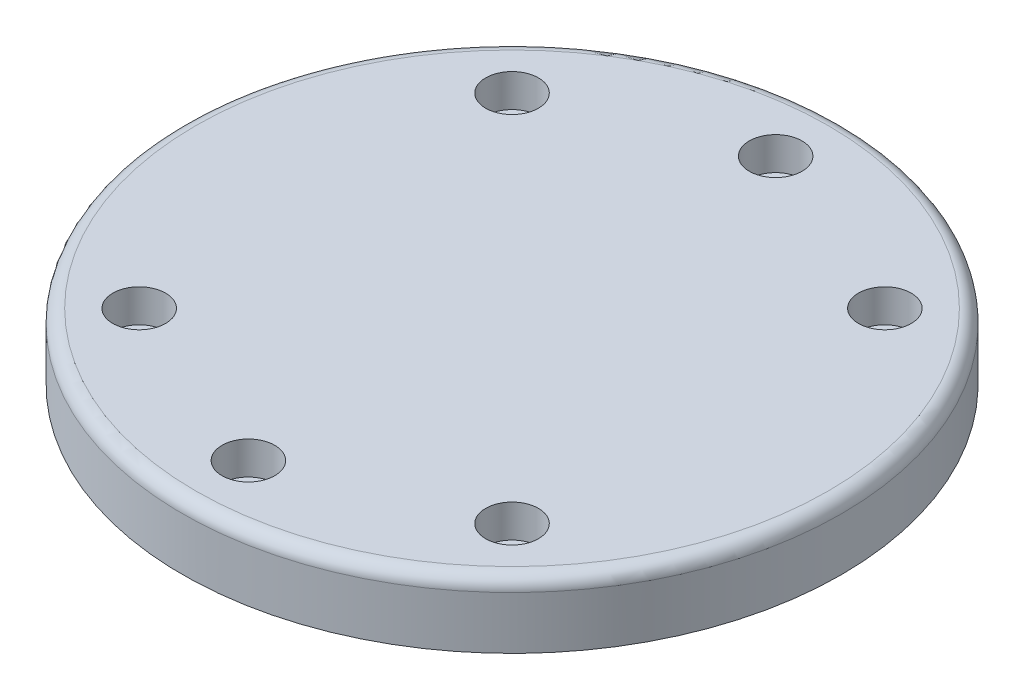
ISO-10303-21;
HEADER;
FILE_DESCRIPTION(('STEP AP214'),'2;1');
FILE_NAME('part.step','',(''),(''),'','','');
FILE_SCHEMA(('AUTOMOTIVE_DESIGN { 1 0 10303 214 1 1 1 1 }'));
ENDSEC;
DATA;
#1=APPLICATION_CONTEXT('core data for automotive mechanical design processes');
#2=APPLICATION_PROTOCOL_DEFINITION('international standard','automotive_design',2000,#1);
#3=PRODUCT_CONTEXT('',#1,'mechanical');
#4=PRODUCT('Part','Part','',(#3));
#5=PRODUCT_RELATED_PRODUCT_CATEGORY('part','',(#4));
#6=PRODUCT_DEFINITION_FORMATION('','',#4);
#7=PRODUCT_DEFINITION_CONTEXT('part definition',#1,'design');
#8=PRODUCT_DEFINITION('design','',#6,#7);
#9=PRODUCT_DEFINITION_SHAPE('','',#8);
#10=(LENGTH_UNIT() NAMED_UNIT(*) SI_UNIT(.MILLI.,.METRE.));
#11=(NAMED_UNIT(*) PLANE_ANGLE_UNIT() SI_UNIT($,.RADIAN.));
#12=(NAMED_UNIT(*) SI_UNIT($,.STERADIAN.) SOLID_ANGLE_UNIT());
#13=UNCERTAINTY_MEASURE_WITH_UNIT(LENGTH_MEASURE(1.E-05),#10,'distance_accuracy_value','');
#14=(GEOMETRIC_REPRESENTATION_CONTEXT(3) GLOBAL_UNCERTAINTY_ASSIGNED_CONTEXT((#13)) GLOBAL_UNIT_ASSIGNED_CONTEXT((#10,
#11,#12)) REPRESENTATION_CONTEXT('',''));
#15=CARTESIAN_POINT('',(0.,0.,0.));
#16=DIRECTION('',(0.,0.,1.));
#17=DIRECTION('',(1.,0.,0.));
#18=AXIS2_PLACEMENT_3D('',#15,#16,#17);
#19=CARTESIAN_POINT('',(0.,0.,0.));
#20=DIRECTION('',(0.,1.,0.));
#21=DIRECTION('',(1.,0.,0.));
#22=AXIS2_PLACEMENT_3D('',#19,#20,#21);
#23=PLANE('',#22);
#24=CARTESIAN_POINT('',(0.,0.,-40.));
#25=DIRECTION('',(0.,1.,0.));
#26=DIRECTION('',(1.,0.,0.));
#27=AXIS2_PLACEMENT_3D('',#24,#25,#26);
#28=CIRCLE('',#27,2.25);
#29=CARTESIAN_POINT('',(-2.25,0.,-40.));
#30=VERTEX_POINT('',#29);
#31=EDGE_CURVE('E184',#30,#30,#28,.T.);
#32=ORIENTED_EDGE('',*,*,#31,.T.);
#33=EDGE_LOOP('',(#32));
#34=FACE_BOUND('',#33,.T.);
#35=CARTESIAN_POINT('',(0.,0.,40.));
#36=DIRECTION('',(0.,1.,0.));
#37=DIRECTION('',(1.,0.,0.));
#38=AXIS2_PLACEMENT_3D('',#35,#36,#37);
#39=CIRCLE('',#38,2.25);
#40=CARTESIAN_POINT('',(-2.25,0.,40.));
#41=VERTEX_POINT('',#40);
#42=EDGE_CURVE('E244',#41,#41,#39,.T.);
#43=ORIENTED_EDGE('',*,*,#42,.T.);
#44=EDGE_LOOP('',(#43));
#45=FACE_BOUND('',#44,.T.);
#46=CARTESIAN_POINT('',(-28.2842712474619,0.,-28.2842712474619));
#47=DIRECTION('',(0.,1.,0.));
#48=DIRECTION('',(1.,0.,0.));
#49=AXIS2_PLACEMENT_3D('',#46,#47,#48);
#50=CIRCLE('',#49,2.);
#51=CARTESIAN_POINT('',(-30.2842712474619,0.,-28.2842712474619));
#52=VERTEX_POINT('',#51);
#53=EDGE_CURVE('E164',#52,#52,#50,.T.);
#54=ORIENTED_EDGE('',*,*,#53,.T.);
#55=EDGE_LOOP('',(#54));
#56=FACE_BOUND('',#55,.T.);
#57=CARTESIAN_POINT('',(28.2842712474619,0.,28.2842712474619));
#58=DIRECTION('',(0.,1.,0.));
#59=DIRECTION('',(1.,0.,0.));
#60=AXIS2_PLACEMENT_3D('',#57,#58,#59);
#61=CIRCLE('',#60,2.);
#62=CARTESIAN_POINT('',(26.2842712474619,0.,28.2842712474619));
#63=VERTEX_POINT('',#62);
#64=EDGE_CURVE('E203',#63,#63,#61,.T.);
#65=ORIENTED_EDGE('',*,*,#64,.T.);
#66=EDGE_LOOP('',(#65));
#67=FACE_BOUND('',#66,.T.);
#68=CARTESIAN_POINT('',(-28.2842712474619,0.,28.2842712474619));
#69=DIRECTION('',(0.,1.,0.));
#70=DIRECTION('',(1.,0.,0.));
#71=AXIS2_PLACEMENT_3D('',#68,#69,#70);
#72=CIRCLE('',#71,2.);
#73=CARTESIAN_POINT('',(-30.2842712474619,0.,28.2842712474619));
#74=VERTEX_POINT('',#73);
#75=EDGE_CURVE('E145',#74,#74,#72,.T.);
#76=ORIENTED_EDGE('',*,*,#75,.T.);
#77=EDGE_LOOP('',(#76));
#78=FACE_BOUND('',#77,.T.);
#79=CARTESIAN_POINT('',(28.2842712474619,0.,-28.2842712474619));
#80=DIRECTION('',(0.,1.,0.));
#81=DIRECTION('',(1.,0.,0.));
#82=AXIS2_PLACEMENT_3D('',#79,#80,#81);
#83=CIRCLE('',#82,2.);
#84=CARTESIAN_POINT('',(26.2842712474619,0.,-28.2842712474619));
#85=VERTEX_POINT('',#84);
#86=EDGE_CURVE('E220',#85,#85,#83,.T.);
#87=ORIENTED_EDGE('',*,*,#86,.T.);
#88=EDGE_LOOP('',(#87));
#89=FACE_BOUND('',#88,.T.);
#90=CARTESIAN_POINT('',(0.,0.,0.));
#91=DIRECTION('',(0.,1.,0.));
#92=DIRECTION('',(-1.,0.,0.));
#93=AXIS2_PLACEMENT_3D('',#90,#91,#92);
#94=CIRCLE('',#93,50.);
#95=CARTESIAN_POINT('',(50.,0.,0.));
#96=VERTEX_POINT('',#95);
#97=EDGE_CURVE('E11',#96,#96,#94,.T.);
#98=ORIENTED_EDGE('',*,*,#97,.F.);
#99=EDGE_LOOP('',(#98));
#100=FACE_BOUND('',#99,.T.);
#101=ADVANCED_FACE('F17',(#34,#45,#56,#67,#78,#89,#100),#23,.F.);
#102=CARTESIAN_POINT('',(0.,10.,0.));
#103=DIRECTION('',(0.,1.,0.));
#104=DIRECTION('',(1.,0.,0.));
#105=AXIS2_PLACEMENT_3D('',#102,#103,#104);
#106=PLANE('',#105);
#107=CARTESIAN_POINT('',(0.,10.,-40.));
#108=DIRECTION('',(0.,-1.,0.));
#109=DIRECTION('',(1.,0.,0.));
#110=AXIS2_PLACEMENT_3D('',#107,#108,#109);
#111=CIRCLE('',#110,4.);
#112=CARTESIAN_POINT('',(-4.,10.,-40.));
#113=VERTEX_POINT('',#112);
#114=EDGE_CURVE('E208',#113,#113,#111,.T.);
#115=ORIENTED_EDGE('',*,*,#114,.T.);
#116=EDGE_LOOP('',(#115));
#117=FACE_BOUND('',#116,.T.);
#118=CARTESIAN_POINT('',(0.,10.,40.));
#119=DIRECTION('',(0.,-1.,0.));
#120=DIRECTION('',(1.,0.,0.));
#121=AXIS2_PLACEMENT_3D('',#118,#119,#120);
#122=CIRCLE('',#121,4.);
#123=CARTESIAN_POINT('',(-4.,10.,40.));
#124=VERTEX_POINT('',#123);
#125=EDGE_CURVE('E21',#124,#124,#122,.T.);
#126=ORIENTED_EDGE('',*,*,#125,.T.);
#127=EDGE_LOOP('',(#126));
#128=FACE_BOUND('',#127,.T.);
#129=CARTESIAN_POINT('',(-28.2842712474619,10.,-28.2842712474619));
#130=DIRECTION('',(0.,-1.,0.));
#131=DIRECTION('',(1.,0.,0.));
#132=AXIS2_PLACEMENT_3D('',#129,#130,#131);
#133=CIRCLE('',#132,4.);
#134=CARTESIAN_POINT('',(-32.2842712474619,10.,-28.2842712474619));
#135=VERTEX_POINT('',#134);
#136=EDGE_CURVE('E193',#135,#135,#133,.T.);
#137=ORIENTED_EDGE('',*,*,#136,.T.);
#138=EDGE_LOOP('',(#137));
#139=FACE_BOUND('',#138,.T.);
#140=CARTESIAN_POINT('',(28.2842712474619,10.,28.2842712474619));
#141=DIRECTION('',(0.,-1.,0.));
#142=DIRECTION('',(1.,0.,0.));
#143=AXIS2_PLACEMENT_3D('',#140,#141,#142);
#144=CIRCLE('',#143,4.);
#145=CARTESIAN_POINT('',(24.2842712474619,10.,28.2842712474619));
#146=VERTEX_POINT('',#145);
#147=EDGE_CURVE('E227',#146,#146,#144,.T.);
#148=ORIENTED_EDGE('',*,*,#147,.T.);
#149=EDGE_LOOP('',(#148));
#150=FACE_BOUND('',#149,.T.);
#151=CARTESIAN_POINT('',(-28.2842712474619,10.,28.2842712474619));
#152=DIRECTION('',(0.,-1.,0.));
#153=DIRECTION('',(1.,0.,0.));
#154=AXIS2_PLACEMENT_3D('',#151,#152,#153);
#155=CIRCLE('',#154,4.);
#156=CARTESIAN_POINT('',(-32.2842712474619,10.,28.2842712474619));
#157=VERTEX_POINT('',#156);
#158=EDGE_CURVE('E178',#157,#157,#155,.T.);
#159=ORIENTED_EDGE('',*,*,#158,.T.);
#160=EDGE_LOOP('',(#159));
#161=FACE_BOUND('',#160,.T.);
#162=CARTESIAN_POINT('',(28.2842712474619,10.,-28.2842712474619));
#163=DIRECTION('',(0.,-1.,0.));
#164=DIRECTION('',(1.,0.,0.));
#165=AXIS2_PLACEMENT_3D('',#162,#163,#164);
#166=CIRCLE('',#165,4.);
#167=CARTESIAN_POINT('',(24.2842712474619,10.,-28.2842712474619));
#168=VERTEX_POINT('',#167);
#169=EDGE_CURVE('E167',#168,#168,#166,.T.);
#170=ORIENTED_EDGE('',*,*,#169,.T.);
#171=EDGE_LOOP('',(#170));
#172=FACE_BOUND('',#171,.T.);
#173=CARTESIAN_POINT('',(0.,10.,0.));
#174=DIRECTION('',(0.,-1.,0.));
#175=DIRECTION('',(1.,0.,0.));
#176=AXIS2_PLACEMENT_3D('',#173,#174,#175);
#177=CIRCLE('',#176,48.);
#178=CARTESIAN_POINT('',(0.,10.,-48.));
#179=VERTEX_POINT('',#178);
#180=EDGE_CURVE('E179',#179,#179,#177,.T.);
#181=ORIENTED_EDGE('',*,*,#180,.F.);
#182=EDGE_LOOP('',(#181));
#183=FACE_BOUND('',#182,.T.);
#184=ADVANCED_FACE('F453',(#117,#128,#139,#150,#161,#172,#183),#106,.T.);
#185=CARTESIAN_POINT('',(0.,0.,0.));
#186=DIRECTION('',(0.,1.,0.));
#187=DIRECTION('',(-1.,0.,0.));
#188=AXIS2_PLACEMENT_3D('',#185,#186,#187);
#189=CYLINDRICAL_SURFACE('',#188,50.);
#190=CARTESIAN_POINT('',(0.,8.,0.));
#191=DIRECTION('',(0.,1.,0.));
#192=DIRECTION('',(1.,0.,0.));
#193=AXIS2_PLACEMENT_3D('',#190,#191,#192);
#194=CIRCLE('',#193,50.);
#195=CARTESIAN_POINT('',(0.,8.,-50.));
#196=VERTEX_POINT('',#195);
#197=CARTESIAN_POINT('',(50.,8.,0.));
#198=VERTEX_POINT('',#197);
#199=EDGE_CURVE('E281',#196,#198,#194,.T.);
#200=ORIENTED_EDGE('',*,*,#199,.F.);
#201=CARTESIAN_POINT('',(0.,8.,0.));
#202=DIRECTION('',(0.,1.,0.));
#203=DIRECTION('',(1.,0.,0.));
#204=AXIS2_PLACEMENT_3D('',#201,#202,#203);
#205=CIRCLE('',#204,50.);
#206=EDGE_CURVE('E252',#198,#196,#205,.T.);
#207=ORIENTED_EDGE('',*,*,#206,.F.);
#208=DIRECTION('',(0.,-1.,0.));
#209=VECTOR('',#208,1.);
#210=CARTESIAN_POINT('',(50.,0.,0.));
#211=LINE('',#210,#209);
#212=EDGE_CURVE('E28',#198,#96,#211,.T.);
#213=ORIENTED_EDGE('',*,*,#212,.T.);
#214=ORIENTED_EDGE('',*,*,#97,.T.);
#215=ORIENTED_EDGE('',*,*,#212,.F.);
#216=EDGE_LOOP('',(#200,#207,#213,#214,#215));
#217=FACE_BOUND('',#216,.T.);
#218=ADVANCED_FACE('F19',(#217),#189,.T.);
#219=CARTESIAN_POINT('',(0.,8.,0.));
#220=DIRECTION('',(0.,1.,0.));
#221=DIRECTION('',(0.,0.,1.));
#222=AXIS2_PLACEMENT_3D('',#219,#220,#221);
#223=TOROIDAL_SURFACE('',#222,48.,2.);
#224=ORIENTED_EDGE('',*,*,#180,.T.);
#225=CARTESIAN_POINT('',(0.,8.,-48.));
#226=DIRECTION('',(-1.,0.,0.));
#227=DIRECTION('',(0.,0.,-1.));
#228=AXIS2_PLACEMENT_3D('',#225,#226,#227);
#229=CIRCLE('',#228,2.);
#230=EDGE_CURVE('E183',#179,#196,#229,.T.);
#231=ORIENTED_EDGE('',*,*,#230,.T.);
#232=ORIENTED_EDGE('',*,*,#199,.T.);
#233=ORIENTED_EDGE('',*,*,#206,.T.);
#234=ORIENTED_EDGE('',*,*,#230,.F.);
#235=EDGE_LOOP('',(#224,#231,#232,#233,#234));
#236=FACE_BOUND('',#235,.T.);
#237=ADVANCED_FACE('F450',(#236),#223,.T.);
#238=CARTESIAN_POINT('',(0.,-134.274468787578,-40.));
#239=DIRECTION('',(0.,1.,0.));
#240=DIRECTION('',(1.,0.,0.));
#241=AXIS2_PLACEMENT_3D('',#238,#239,#240);
#242=CYLINDRICAL_SURFACE('',#241,2.25);
#243=CARTESIAN_POINT('',(0.,5.,-40.));
#244=DIRECTION('',(0.,1.,0.));
#245=DIRECTION('',(1.,0.,0.));
#246=AXIS2_PLACEMENT_3D('',#243,#244,#245);
#247=CIRCLE('',#246,2.25);
#248=CARTESIAN_POINT('',(-2.25,5.,-40.));
#249=VERTEX_POINT('',#248);
#250=EDGE_CURVE('E204',#249,#249,#247,.T.);
#251=ORIENTED_EDGE('',*,*,#250,.T.);
#252=DIRECTION('',(0.,-1.,0.));
#253=VECTOR('',#252,1.);
#254=CARTESIAN_POINT('',(-2.25,-134.274468787578,-40.));
#255=LINE('',#254,#253);
#256=EDGE_CURVE('E195',#249,#30,#255,.T.);
#257=ORIENTED_EDGE('',*,*,#256,.T.);
#258=ORIENTED_EDGE('',*,*,#31,.F.);
#259=ORIENTED_EDGE('',*,*,#256,.F.);
#260=EDGE_LOOP('',(#251,#257,#258,#259));
#261=FACE_BOUND('',#260,.T.);
#262=ADVANCED_FACE('F459',(#261),#242,.F.);
#263=CARTESIAN_POINT('',(0.,7.5,-40.));
#264=DIRECTION('',(0.,1.,0.));
#265=DIRECTION('',(1.,0.,0.));
#266=AXIS2_PLACEMENT_3D('',#263,#264,#265);
#267=CYLINDRICAL_SURFACE('',#266,4.);
#268=ORIENTED_EDGE('',*,*,#114,.F.);
#269=DIRECTION('',(0.,-1.,0.));
#270=VECTOR('',#269,1.);
#271=CARTESIAN_POINT('',(-4.,7.5,-40.));
#272=LINE('',#271,#270);
#273=CARTESIAN_POINT('',(-4.,5.,-40.));
#274=VERTEX_POINT('',#273);
#275=EDGE_CURVE('E199',#113,#274,#272,.T.);
#276=ORIENTED_EDGE('',*,*,#275,.T.);
#277=CARTESIAN_POINT('',(0.,5.,-40.));
#278=DIRECTION('',(0.,1.,0.));
#279=DIRECTION('',(1.,0.,0.));
#280=AXIS2_PLACEMENT_3D('',#277,#278,#279);
#281=CIRCLE('',#280,4.);
#282=EDGE_CURVE('E209',#274,#274,#281,.T.);
#283=ORIENTED_EDGE('',*,*,#282,.F.);
#284=ORIENTED_EDGE('',*,*,#275,.F.);
#285=EDGE_LOOP('',(#268,#276,#283,#284));
#286=FACE_BOUND('',#285,.T.);
#287=ADVANCED_FACE('F472',(#286),#267,.F.);
#288=CARTESIAN_POINT('',(0.,5.,-40.));
#289=DIRECTION('',(0.,1.,0.));
#290=DIRECTION('',(1.,0.,0.));
#291=AXIS2_PLACEMENT_3D('',#288,#289,#290);
#292=PLANE('',#291);
#293=ORIENTED_EDGE('',*,*,#250,.F.);
#294=EDGE_LOOP('',(#293));
#295=FACE_BOUND('',#294,.T.);
#296=ORIENTED_EDGE('',*,*,#282,.T.);
#297=EDGE_LOOP('',(#296));
#298=FACE_BOUND('',#297,.T.);
#299=ADVANCED_FACE('F469',(#295,#298),#292,.T.);
#300=CARTESIAN_POINT('',(0.,-134.274468787578,40.));
#301=DIRECTION('',(0.,1.,0.));
#302=DIRECTION('',(1.,0.,0.));
#303=AXIS2_PLACEMENT_3D('',#300,#301,#302);
#304=CYLINDRICAL_SURFACE('',#303,2.25);
#305=CARTESIAN_POINT('',(0.,5.,40.));
#306=DIRECTION('',(0.,1.,0.));
#307=DIRECTION('',(1.,0.,0.));
#308=AXIS2_PLACEMENT_3D('',#305,#306,#307);
#309=CIRCLE('',#308,2.25);
#310=CARTESIAN_POINT('',(-2.25,5.,40.));
#311=VERTEX_POINT('',#310);
#312=EDGE_CURVE('E271',#311,#311,#309,.T.);
#313=ORIENTED_EDGE('',*,*,#312,.T.);
#314=DIRECTION('',(0.,-1.,0.));
#315=VECTOR('',#314,1.);
#316=CARTESIAN_POINT('',(-2.25,-134.274468787578,40.));
#317=LINE('',#316,#315);
#318=EDGE_CURVE('E232',#311,#41,#317,.T.);
#319=ORIENTED_EDGE('',*,*,#318,.T.);
#320=ORIENTED_EDGE('',*,*,#42,.F.);
#321=ORIENTED_EDGE('',*,*,#318,.F.);
#322=EDGE_LOOP('',(#313,#319,#320,#321));
#323=FACE_BOUND('',#322,.T.);
#324=ADVANCED_FACE('F316',(#323),#304,.F.);
#325=CARTESIAN_POINT('',(0.,7.5,40.));
#326=DIRECTION('',(0.,1.,0.));
#327=DIRECTION('',(1.,0.,0.));
#328=AXIS2_PLACEMENT_3D('',#325,#326,#327);
#329=CYLINDRICAL_SURFACE('',#328,4.);
#330=ORIENTED_EDGE('',*,*,#125,.F.);
#331=DIRECTION('',(0.,-1.,0.));
#332=VECTOR('',#331,1.);
#333=CARTESIAN_POINT('',(-4.,7.5,40.));
#334=LINE('',#333,#332);
#335=CARTESIAN_POINT('',(-4.,5.,40.));
#336=VERTEX_POINT('',#335);
#337=EDGE_CURVE('E229',#124,#336,#334,.T.);
#338=ORIENTED_EDGE('',*,*,#337,.T.);
#339=CARTESIAN_POINT('',(0.,5.,40.));
#340=DIRECTION('',(0.,1.,0.));
#341=DIRECTION('',(1.,0.,0.));
#342=AXIS2_PLACEMENT_3D('',#339,#340,#341);
#343=CIRCLE('',#342,4.);
#344=EDGE_CURVE('E275',#336,#336,#343,.T.);
#345=ORIENTED_EDGE('',*,*,#344,.F.);
#346=ORIENTED_EDGE('',*,*,#337,.F.);
#347=EDGE_LOOP('',(#330,#338,#345,#346));
#348=FACE_BOUND('',#347,.T.);
#349=ADVANCED_FACE('F323',(#348),#329,.F.);
#350=CARTESIAN_POINT('',(0.,5.,40.));
#351=DIRECTION('',(0.,1.,0.));
#352=DIRECTION('',(1.,0.,0.));
#353=AXIS2_PLACEMENT_3D('',#350,#351,#352);
#354=PLANE('',#353);
#355=ORIENTED_EDGE('',*,*,#312,.F.);
#356=EDGE_LOOP('',(#355));
#357=FACE_BOUND('',#356,.T.);
#358=ORIENTED_EDGE('',*,*,#344,.T.);
#359=EDGE_LOOP('',(#358));
#360=FACE_BOUND('',#359,.T.);
#361=ADVANCED_FACE('F319',(#357,#360),#354,.T.);
#362=CARTESIAN_POINT('',(-28.2842712474619,-131.774468787578,-28.2842712474619));
#363=DIRECTION('',(0.,1.,0.));
#364=DIRECTION('',(1.,0.,0.));
#365=AXIS2_PLACEMENT_3D('',#362,#363,#364);
#366=CYLINDRICAL_SURFACE('',#365,2.);
#367=CARTESIAN_POINT('',(-28.2842712474619,5.,-28.2842712474619));
#368=DIRECTION('',(0.,1.,0.));
#369=DIRECTION('',(1.,0.,0.));
#370=AXIS2_PLACEMENT_3D('',#367,#368,#369);
#371=CIRCLE('',#370,2.);
#372=CARTESIAN_POINT('',(-30.2842712474619,5.,-28.2842712474619));
#373=VERTEX_POINT('',#372);
#374=EDGE_CURVE('E189',#373,#373,#371,.T.);
#375=ORIENTED_EDGE('',*,*,#374,.T.);
#376=DIRECTION('',(0.,-1.,0.));
#377=VECTOR('',#376,1.);
#378=CARTESIAN_POINT('',(-30.2842712474619,-131.774468787578,-28.2842712474619));
#379=LINE('',#378,#377);
#380=EDGE_CURVE('E210',#373,#52,#379,.T.);
#381=ORIENTED_EDGE('',*,*,#380,.T.);
#382=ORIENTED_EDGE('',*,*,#53,.F.);
#383=ORIENTED_EDGE('',*,*,#380,.F.);
#384=EDGE_LOOP('',(#375,#381,#382,#383));
#385=FACE_BOUND('',#384,.T.);
#386=ADVANCED_FACE('F322',(#385),#366,.F.);
#387=CARTESIAN_POINT('',(-28.2842712474619,7.5,-28.2842712474619));
#388=DIRECTION('',(0.,1.,0.));
#389=DIRECTION('',(1.,0.,0.));
#390=AXIS2_PLACEMENT_3D('',#387,#388,#389);
#391=CYLINDRICAL_SURFACE('',#390,4.);
#392=ORIENTED_EDGE('',*,*,#136,.F.);
#393=DIRECTION('',(0.,-1.,0.));
#394=VECTOR('',#393,1.);
#395=CARTESIAN_POINT('',(-32.2842712474619,7.5,-28.2842712474619));
#396=LINE('',#395,#394);
#397=CARTESIAN_POINT('',(-32.2842712474619,5.,-28.2842712474619));
#398=VERTEX_POINT('',#397);
#399=EDGE_CURVE('E214',#135,#398,#396,.T.);
#400=ORIENTED_EDGE('',*,*,#399,.T.);
#401=CARTESIAN_POINT('',(-28.2842712474619,5.,-28.2842712474619));
#402=DIRECTION('',(0.,1.,0.));
#403=DIRECTION('',(1.,0.,0.));
#404=AXIS2_PLACEMENT_3D('',#401,#402,#403);
#405=CIRCLE('',#404,4.);
#406=EDGE_CURVE('E194',#398,#398,#405,.T.);
#407=ORIENTED_EDGE('',*,*,#406,.F.);
#408=ORIENTED_EDGE('',*,*,#399,.F.);
#409=EDGE_LOOP('',(#392,#400,#407,#408));
#410=FACE_BOUND('',#409,.T.);
#411=ADVANCED_FACE('F494',(#410),#391,.F.);
#412=CARTESIAN_POINT('',(-28.2842712474619,5.,-28.2842712474619));
#413=DIRECTION('',(0.,1.,0.));
#414=DIRECTION('',(1.,0.,0.));
#415=AXIS2_PLACEMENT_3D('',#412,#413,#414);
#416=PLANE('',#415);
#417=ORIENTED_EDGE('',*,*,#374,.F.);
#418=EDGE_LOOP('',(#417));
#419=FACE_BOUND('',#418,.T.);
#420=ORIENTED_EDGE('',*,*,#406,.T.);
#421=EDGE_LOOP('',(#420));
#422=FACE_BOUND('',#421,.T.);
#423=ADVANCED_FACE('F490',(#419,#422),#416,.T.);
#424=CARTESIAN_POINT('',(28.2842712474619,-131.774468787578,28.2842712474619));
#425=DIRECTION('',(0.,1.,0.));
#426=DIRECTION('',(1.,0.,0.));
#427=AXIS2_PLACEMENT_3D('',#424,#425,#426);
#428=CYLINDRICAL_SURFACE('',#427,2.);
#429=CARTESIAN_POINT('',(28.2842712474619,5.,28.2842712474619));
#430=DIRECTION('',(0.,1.,0.));
#431=DIRECTION('',(1.,0.,0.));
#432=AXIS2_PLACEMENT_3D('',#429,#430,#431);
#433=CIRCLE('',#432,2.);
#434=CARTESIAN_POINT('',(26.2842712474619,5.,28.2842712474619));
#435=VERTEX_POINT('',#434);
#436=EDGE_CURVE('E159',#435,#435,#433,.T.);
#437=ORIENTED_EDGE('',*,*,#436,.T.);
#438=DIRECTION('',(0.,-1.,0.));
#439=VECTOR('',#438,1.);
#440=CARTESIAN_POINT('',(26.2842712474619,-131.774468787578,28.2842712474619));
#441=LINE('',#440,#439);
#442=EDGE_CURVE('E226',#435,#63,#441,.T.);
#443=ORIENTED_EDGE('',*,*,#442,.T.);
#444=ORIENTED_EDGE('',*,*,#64,.F.);
#445=ORIENTED_EDGE('',*,*,#442,.F.);
#446=EDGE_LOOP('',(#437,#443,#444,#445));
#447=FACE_BOUND('',#446,.T.);
#448=ADVANCED_FACE('F493',(#447),#428,.F.);
#449=CARTESIAN_POINT('',(28.2842712474619,7.5,28.2842712474619));
#450=DIRECTION('',(0.,1.,0.));
#451=DIRECTION('',(1.,0.,0.));
#452=AXIS2_PLACEMENT_3D('',#449,#450,#451);
#453=CYLINDRICAL_SURFACE('',#452,4.);
#454=ORIENTED_EDGE('',*,*,#147,.F.);
#455=DIRECTION('',(0.,-1.,0.));
#456=VECTOR('',#455,1.);
#457=CARTESIAN_POINT('',(24.2842712474619,7.5,28.2842712474619));
#458=LINE('',#457,#456);
#459=CARTESIAN_POINT('',(24.2842712474619,5.,28.2842712474619));
#460=VERTEX_POINT('',#459);
#461=EDGE_CURVE('E224',#146,#460,#458,.T.);
#462=ORIENTED_EDGE('',*,*,#461,.T.);
#463=CARTESIAN_POINT('',(28.2842712474619,5.,28.2842712474619));
#464=DIRECTION('',(0.,1.,0.));
#465=DIRECTION('',(1.,0.,0.));
#466=AXIS2_PLACEMENT_3D('',#463,#464,#465);
#467=CIRCLE('',#466,4.);
#468=EDGE_CURVE('E150',#460,#460,#467,.T.);
#469=ORIENTED_EDGE('',*,*,#468,.F.);
#470=ORIENTED_EDGE('',*,*,#461,.F.);
#471=EDGE_LOOP('',(#454,#462,#469,#470));
#472=FACE_BOUND('',#471,.T.);
#473=ADVANCED_FACE('F483',(#472),#453,.F.);
#474=CARTESIAN_POINT('',(28.2842712474619,5.,28.2842712474619));
#475=DIRECTION('',(0.,1.,0.));
#476=DIRECTION('',(1.,0.,0.));
#477=AXIS2_PLACEMENT_3D('',#474,#475,#476);
#478=PLANE('',#477);
#479=ORIENTED_EDGE('',*,*,#436,.F.);
#480=EDGE_LOOP('',(#479));
#481=FACE_BOUND('',#480,.T.);
#482=ORIENTED_EDGE('',*,*,#468,.T.);
#483=EDGE_LOOP('',(#482));
#484=FACE_BOUND('',#483,.T.);
#485=ADVANCED_FACE('F480',(#481,#484),#478,.T.);
#486=CARTESIAN_POINT('',(-28.2842712474619,-131.774468787578,28.2842712474619));
#487=DIRECTION('',(0.,1.,0.));
#488=DIRECTION('',(1.,0.,0.));
#489=AXIS2_PLACEMENT_3D('',#486,#487,#488);
#490=CYLINDRICAL_SURFACE('',#489,2.);
#491=CARTESIAN_POINT('',(-28.2842712474619,5.,28.2842712474619));
#492=DIRECTION('',(0.,1.,0.));
#493=DIRECTION('',(1.,0.,0.));
#494=AXIS2_PLACEMENT_3D('',#491,#492,#493);
#495=CIRCLE('',#494,2.);
#496=CARTESIAN_POINT('',(-30.2842712474619,5.,28.2842712474619));
#497=VERTEX_POINT('',#496);
#498=EDGE_CURVE('E219',#497,#497,#495,.T.);
#499=ORIENTED_EDGE('',*,*,#498,.T.);
#500=DIRECTION('',(0.,-1.,0.));
#501=VECTOR('',#500,1.);
#502=CARTESIAN_POINT('',(-30.2842712474619,-131.774468787578,28.2842712474619));
#503=LINE('',#502,#501);
#504=EDGE_CURVE('E151',#497,#74,#503,.T.);
#505=ORIENTED_EDGE('',*,*,#504,.T.);
#506=ORIENTED_EDGE('',*,*,#75,.F.);
#507=ORIENTED_EDGE('',*,*,#504,.F.);
#508=EDGE_LOOP('',(#499,#505,#506,#507));
#509=FACE_BOUND('',#508,.T.);
#510=ADVANCED_FACE('F478',(#509),#490,.F.);
#511=CARTESIAN_POINT('',(-28.2842712474619,7.5,28.2842712474619));
#512=DIRECTION('',(0.,1.,0.));
#513=DIRECTION('',(1.,0.,0.));
#514=AXIS2_PLACEMENT_3D('',#511,#512,#513);
#515=CYLINDRICAL_SURFACE('',#514,4.);
#516=ORIENTED_EDGE('',*,*,#158,.F.);
#517=DIRECTION('',(0.,-1.,0.));
#518=VECTOR('',#517,1.);
#519=CARTESIAN_POINT('',(-32.2842712474619,7.5,28.2842712474619));
#520=LINE('',#519,#518);
#521=CARTESIAN_POINT('',(-32.2842712474619,5.,28.2842712474619));
#522=VERTEX_POINT('',#521);
#523=EDGE_CURVE('E161',#157,#522,#520,.T.);
#524=ORIENTED_EDGE('',*,*,#523,.T.);
#525=CARTESIAN_POINT('',(-28.2842712474619,5.,28.2842712474619));
#526=DIRECTION('',(0.,1.,0.));
#527=DIRECTION('',(1.,0.,0.));
#528=AXIS2_PLACEMENT_3D('',#525,#526,#527);
#529=CIRCLE('',#528,4.);
#530=EDGE_CURVE('E215',#522,#522,#529,.T.);
#531=ORIENTED_EDGE('',*,*,#530,.F.);
#532=ORIENTED_EDGE('',*,*,#523,.F.);
#533=EDGE_LOOP('',(#516,#524,#531,#532));
#534=FACE_BOUND('',#533,.T.);
#535=ADVANCED_FACE('F474',(#534),#515,.F.);
#536=CARTESIAN_POINT('',(-28.2842712474619,5.,28.2842712474619));
#537=DIRECTION('',(0.,1.,0.));
#538=DIRECTION('',(1.,0.,0.));
#539=AXIS2_PLACEMENT_3D('',#536,#537,#538);
#540=PLANE('',#539);
#541=ORIENTED_EDGE('',*,*,#498,.F.);
#542=EDGE_LOOP('',(#541));
#543=FACE_BOUND('',#542,.T.);
#544=ORIENTED_EDGE('',*,*,#530,.T.);
#545=EDGE_LOOP('',(#544));
#546=FACE_BOUND('',#545,.T.);
#547=ADVANCED_FACE('F477',(#543,#546),#540,.T.);
#548=CARTESIAN_POINT('',(28.2842712474619,-131.774468787578,-28.2842712474619));
#549=DIRECTION('',(0.,1.,0.));
#550=DIRECTION('',(1.,0.,0.));
#551=AXIS2_PLACEMENT_3D('',#548,#549,#550);
#552=CYLINDRICAL_SURFACE('',#551,2.);
#553=CARTESIAN_POINT('',(28.2842712474619,5.,-28.2842712474619));
#554=DIRECTION('',(0.,1.,0.));
#555=DIRECTION('',(1.,0.,0.));
#556=AXIS2_PLACEMENT_3D('',#553,#554,#555);
#557=CIRCLE('',#556,2.);
#558=CARTESIAN_POINT('',(26.2842712474619,5.,-28.2842712474619));
#559=VERTEX_POINT('',#558);
#560=EDGE_CURVE('E172',#559,#559,#557,.T.);
#561=ORIENTED_EDGE('',*,*,#560,.T.);
#562=DIRECTION('',(0.,-1.,0.));
#563=VECTOR('',#562,1.);
#564=CARTESIAN_POINT('',(26.2842712474619,-131.774468787578,-28.2842712474619));
#565=LINE('',#564,#563);
#566=EDGE_CURVE('E174',#559,#85,#565,.T.);
#567=ORIENTED_EDGE('',*,*,#566,.T.);
#568=ORIENTED_EDGE('',*,*,#86,.F.);
#569=ORIENTED_EDGE('',*,*,#566,.F.);
#570=EDGE_LOOP('',(#561,#567,#568,#569));
#571=FACE_BOUND('',#570,.T.);
#572=ADVANCED_FACE('F504',(#571),#552,.F.);
#573=CARTESIAN_POINT('',(28.2842712474619,7.5,-28.2842712474619));
#574=DIRECTION('',(0.,1.,0.));
#575=DIRECTION('',(1.,0.,0.));
#576=AXIS2_PLACEMENT_3D('',#573,#574,#575);
#577=CYLINDRICAL_SURFACE('',#576,4.);
#578=ORIENTED_EDGE('',*,*,#169,.F.);
#579=DIRECTION('',(0.,-1.,0.));
#580=VECTOR('',#579,1.);
#581=CARTESIAN_POINT('',(24.2842712474619,7.5,-28.2842712474619));
#582=LINE('',#581,#580);
#583=CARTESIAN_POINT('',(24.2842712474619,5.,-28.2842712474619));
#584=VERTEX_POINT('',#583);
#585=EDGE_CURVE('E171',#168,#584,#582,.T.);
#586=ORIENTED_EDGE('',*,*,#585,.T.);
#587=CARTESIAN_POINT('',(28.2842712474619,5.,-28.2842712474619));
#588=DIRECTION('',(0.,1.,0.));
#589=DIRECTION('',(1.,0.,0.));
#590=AXIS2_PLACEMENT_3D('',#587,#588,#589);
#591=CIRCLE('',#590,4.);
#592=EDGE_CURVE('E185',#584,#584,#591,.T.);
#593=ORIENTED_EDGE('',*,*,#592,.F.);
#594=ORIENTED_EDGE('',*,*,#585,.F.);
#595=EDGE_LOOP('',(#578,#586,#593,#594));
#596=FACE_BOUND('',#595,.T.);
#597=ADVANCED_FACE('F488',(#596),#577,.F.);
#598=CARTESIAN_POINT('',(28.2842712474619,5.,-28.2842712474619));
#599=DIRECTION('',(0.,1.,0.));
#600=DIRECTION('',(1.,0.,0.));
#601=AXIS2_PLACEMENT_3D('',#598,#599,#600);
#602=PLANE('',#601);
#603=ORIENTED_EDGE('',*,*,#560,.F.);
#604=EDGE_LOOP('',(#603));
#605=FACE_BOUND('',#604,.T.);
#606=ORIENTED_EDGE('',*,*,#592,.T.);
#607=EDGE_LOOP('',(#606));
#608=FACE_BOUND('',#607,.T.);
#609=ADVANCED_FACE('F485',(#605,#608),#602,.T.);
#610=CLOSED_SHELL('',(#101,#184,#218,#237,#262,#287,#299,#324,#349,#361,#386,#411,#423,#448,
#473,#485,#510,#535,#547,#572,#597,#609));
#611=MANIFOLD_SOLID_BREP('B1',#610);
#612=ADVANCED_BREP_SHAPE_REPRESENTATION('',(#18,#611),#14);
#613=SHAPE_DEFINITION_REPRESENTATION(#9,#612);
ENDSEC;
END-ISO-10303-21;
